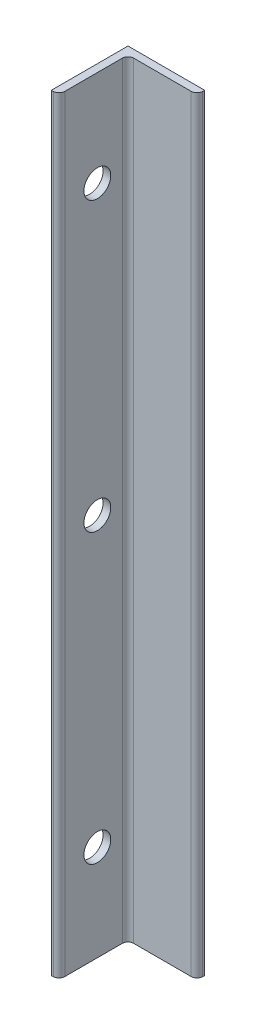
ISO-10303-21;
HEADER;
FILE_DESCRIPTION(('STEP AP214'),'2;1');
FILE_NAME('part.step','',(''),(''),'','','');
FILE_SCHEMA(('AUTOMOTIVE_DESIGN { 1 0 10303 214 1 1 1 1 }'));
ENDSEC;
DATA;
#1=APPLICATION_CONTEXT('core data for automotive mechanical design processes');
#2=APPLICATION_PROTOCOL_DEFINITION('international standard','automotive_design',2000,#1);
#3=PRODUCT_CONTEXT('',#1,'mechanical');
#4=PRODUCT('Part','Part','',(#3));
#5=PRODUCT_RELATED_PRODUCT_CATEGORY('part','',(#4));
#6=PRODUCT_DEFINITION_FORMATION('','',#4);
#7=PRODUCT_DEFINITION_CONTEXT('part definition',#1,'design');
#8=PRODUCT_DEFINITION('design','',#6,#7);
#9=PRODUCT_DEFINITION_SHAPE('','',#8);
#10=(LENGTH_UNIT() NAMED_UNIT(*) SI_UNIT(.MILLI.,.METRE.));
#11=(NAMED_UNIT(*) PLANE_ANGLE_UNIT() SI_UNIT($,.RADIAN.));
#12=(NAMED_UNIT(*) SI_UNIT($,.STERADIAN.) SOLID_ANGLE_UNIT());
#13=UNCERTAINTY_MEASURE_WITH_UNIT(LENGTH_MEASURE(1.E-05),#10,'distance_accuracy_value','');
#14=(GEOMETRIC_REPRESENTATION_CONTEXT(3) GLOBAL_UNCERTAINTY_ASSIGNED_CONTEXT((#13)) GLOBAL_UNIT_ASSIGNED_CONTEXT((#10,
#11,#12)) REPRESENTATION_CONTEXT('',''));
#15=CARTESIAN_POINT('',(0.,0.,0.));
#16=DIRECTION('',(0.,0.,1.));
#17=DIRECTION('',(1.,0.,0.));
#18=AXIS2_PLACEMENT_3D('',#15,#16,#17);
#19=CARTESIAN_POINT('',(-27.4998721449563,400.,-28.2131532770166));
#20=DIRECTION('',(-1.,0.,0.));
#21=DIRECTION('',(0.,0.,1.));
#22=AXIS2_PLACEMENT_3D('',#19,#20,#21);
#23=PLANE('',#22);
#24=DIRECTION('',(0.,0.,-1.));
#25=VECTOR('',#24,1.);
#26=CARTESIAN_POINT('',(-27.4998721449561,3.33066907387547E-12,-28.2131532770167));
#27=LINE('',#26,#25);
#28=CARTESIAN_POINT('',(-27.4998721449561,3.33066907387547E-12,-28.2131532770167));
#29=VERTEX_POINT('',#28);
#30=CARTESIAN_POINT('',(-27.4998721449559,0.,-29.2131532770167));
#31=VERTEX_POINT('',#30);
#32=EDGE_CURVE('E145',#29,#31,#27,.T.);
#33=ORIENTED_EDGE('',*,*,#32,.T.);
#34=DIRECTION('',(0.,-1.,0.));
#35=VECTOR('',#34,1.);
#36=CARTESIAN_POINT('',(-27.4998721449561,400.,-29.2131532770166));
#37=LINE('',#36,#35);
#38=CARTESIAN_POINT('',(-27.4998721449561,400.,-29.2131532770166));
#39=VERTEX_POINT('',#38);
#40=EDGE_CURVE('E13',#39,#31,#37,.T.);
#41=ORIENTED_EDGE('',*,*,#40,.F.);
#42=DIRECTION('',(0.,0.,-1.));
#43=VECTOR('',#42,1.);
#44=CARTESIAN_POINT('',(-27.4998721449563,400.,-28.2131532770166));
#45=LINE('',#44,#43);
#46=CARTESIAN_POINT('',(-27.4998721449563,400.,-28.2131532770166));
#47=VERTEX_POINT('',#46);
#48=EDGE_CURVE('E162',#47,#39,#45,.T.);
#49=ORIENTED_EDGE('',*,*,#48,.F.);
#50=DIRECTION('',(0.,-1.,0.));
#51=VECTOR('',#50,1.);
#52=CARTESIAN_POINT('',(-27.4998721449563,400.,-28.2131532770166));
#53=LINE('',#52,#51);
#54=EDGE_CURVE('E141',#47,#29,#53,.T.);
#55=ORIENTED_EDGE('',*,*,#54,.T.);
#56=EDGE_LOOP('',(#33,#41,#49,#55));
#57=FACE_BOUND('',#56,.T.);
#58=ADVANCED_FACE('F43',(#57),#23,.F.);
#59=CARTESIAN_POINT('',(-27.4998721449561,400.,-29.2131532770166));
#60=DIRECTION('',(0.,0.,1.));
#61=DIRECTION('',(1.,0.,0.));
#62=AXIS2_PLACEMENT_3D('',#59,#60,#61);
#63=PLANE('',#62);
#64=DIRECTION('',(-1.,0.,0.));
#65=VECTOR('',#64,1.);
#66=CARTESIAN_POINT('',(-27.4998721449559,0.,-29.2131532770167));
#67=LINE('',#66,#65);
#68=CARTESIAN_POINT('',(-67.4998721449561,-8.88178419700125E-13,-29.2131532770167));
#69=VERTEX_POINT('',#68);
#70=EDGE_CURVE('E148',#31,#69,#67,.T.);
#71=ORIENTED_EDGE('',*,*,#70,.T.);
#72=DIRECTION('',(0.,-1.,0.));
#73=VECTOR('',#72,1.);
#74=CARTESIAN_POINT('',(-67.4998721449561,400.,-29.2131532770166));
#75=LINE('',#74,#73);
#76=CARTESIAN_POINT('',(-67.4998721449561,400.,-29.2131532770166));
#77=VERTEX_POINT('',#76);
#78=EDGE_CURVE('E51',#77,#69,#75,.T.);
#79=ORIENTED_EDGE('',*,*,#78,.F.);
#80=DIRECTION('',(-1.,0.,0.));
#81=VECTOR('',#80,1.);
#82=CARTESIAN_POINT('',(-27.4998721449561,400.,-29.2131532770166));
#83=LINE('',#82,#81);
#84=EDGE_CURVE('E105',#39,#77,#83,.T.);
#85=ORIENTED_EDGE('',*,*,#84,.F.);
#86=ORIENTED_EDGE('',*,*,#40,.T.);
#87=EDGE_LOOP('',(#71,#79,#85,#86));
#88=FACE_BOUND('',#87,.T.);
#89=ADVANCED_FACE('F245',(#88),#63,.F.);
#90=CARTESIAN_POINT('',(-67.4998721449561,400.,-29.2131532770166));
#91=DIRECTION('',(1.,0.,0.));
#92=DIRECTION('',(0.,0.,-1.));
#93=AXIS2_PLACEMENT_3D('',#90,#91,#92);
#94=PLANE('',#93);
#95=CARTESIAN_POINT('',(-67.4998721449557,350.,-9.21315327701666));
#96=DIRECTION('',(1.,0.,0.));
#97=DIRECTION('',(0.,0.,-1.));
#98=AXIS2_PLACEMENT_3D('',#95,#96,#97);
#99=CIRCLE('',#98,7.00000000000001);
#100=CARTESIAN_POINT('',(-67.4998721449557,350.,-16.2131532770167));
#101=VERTEX_POINT('',#100);
#102=EDGE_CURVE('E149',#101,#101,#99,.T.);
#103=ORIENTED_EDGE('',*,*,#102,.T.);
#104=EDGE_LOOP('',(#103));
#105=FACE_BOUND('',#104,.T.);
#106=CARTESIAN_POINT('',(-67.4998721449561,49.9999999999992,-9.2131532770165));
#107=DIRECTION('',(1.,0.,0.));
#108=DIRECTION('',(0.,0.,-1.));
#109=AXIS2_PLACEMENT_3D('',#106,#107,#108);
#110=CIRCLE('',#109,7.);
#111=CARTESIAN_POINT('',(-67.4998721449561,49.9999999999992,-16.2131532770165));
#112=VERTEX_POINT('',#111);
#113=EDGE_CURVE('E205',#112,#112,#110,.T.);
#114=ORIENTED_EDGE('',*,*,#113,.T.);
#115=EDGE_LOOP('',(#114));
#116=FACE_BOUND('',#115,.T.);
#117=CARTESIAN_POINT('',(-67.4998721449556,200.,-9.21315327701583));
#118=DIRECTION('',(1.,0.,0.));
#119=DIRECTION('',(0.,0.,-1.));
#120=AXIS2_PLACEMENT_3D('',#117,#118,#119);
#121=CIRCLE('',#120,7.00000000000001);
#122=CARTESIAN_POINT('',(-67.4998721449556,200.,-16.2131532770158));
#123=VERTEX_POINT('',#122);
#124=EDGE_CURVE('E208',#123,#123,#121,.T.);
#125=ORIENTED_EDGE('',*,*,#124,.T.);
#126=EDGE_LOOP('',(#125));
#127=FACE_BOUND('',#126,.T.);
#128=DIRECTION('',(0.,0.,1.));
#129=VECTOR('',#128,1.);
#130=CARTESIAN_POINT('',(-67.4998721449561,-8.88178419700125E-13,-29.2131532770167));
#131=LINE('',#130,#129);
#132=CARTESIAN_POINT('',(-67.4998721449561,-8.88178419700125E-13,10.7868467229834));
#133=VERTEX_POINT('',#132);
#134=EDGE_CURVE('E151',#69,#133,#131,.T.);
#135=ORIENTED_EDGE('',*,*,#134,.T.);
#136=DIRECTION('',(0.,-1.,0.));
#137=VECTOR('',#136,1.);
#138=CARTESIAN_POINT('',(-67.4998721449561,400.000000000003,10.7868467229842));
#139=LINE('',#138,#137);
#140=CARTESIAN_POINT('',(-67.4998721449561,400.000000000003,10.7868467229842));
#141=VERTEX_POINT('',#140);
#142=EDGE_CURVE('E172',#141,#133,#139,.T.);
#143=ORIENTED_EDGE('',*,*,#142,.F.);
#144=DIRECTION('',(0.,0.,1.));
#145=VECTOR('',#144,1.);
#146=CARTESIAN_POINT('',(-67.4998721449561,400.,-29.2131532770166));
#147=LINE('',#146,#145);
#148=EDGE_CURVE('E180',#77,#141,#147,.T.);
#149=ORIENTED_EDGE('',*,*,#148,.F.);
#150=ORIENTED_EDGE('',*,*,#78,.T.);
#151=EDGE_LOOP('',(#135,#143,#149,#150));
#152=FACE_BOUND('',#151,.T.);
#153=ADVANCED_FACE('F178',(#105,#116,#127,#152),#94,.F.);
#154=CARTESIAN_POINT('',(-67.4998721449561,400.000000000003,10.7868467229842));
#155=DIRECTION('',(0.,0.,-1.));
#156=DIRECTION('',(-1.,0.,0.));
#157=AXIS2_PLACEMENT_3D('',#154,#155,#156);
#158=PLANE('',#157);
#159=DIRECTION('',(1.,0.,0.));
#160=VECTOR('',#159,1.);
#161=CARTESIAN_POINT('',(-67.4998721449561,-8.88178419700125E-13,10.7868467229834));
#162=LINE('',#161,#160);
#163=CARTESIAN_POINT('',(-66.4998721449561,-8.88178419700125E-13,10.7868467229834));
#164=VERTEX_POINT('',#163);
#165=EDGE_CURVE('E153',#133,#164,#162,.T.);
#166=ORIENTED_EDGE('',*,*,#165,.T.);
#167=DIRECTION('',(0.,-1.,0.));
#168=VECTOR('',#167,1.);
#169=CARTESIAN_POINT('',(-66.4998721449561,400.000000000003,10.7868467229834));
#170=LINE('',#169,#168);
#171=CARTESIAN_POINT('',(-66.4998721449561,400.000000000003,10.7868467229834));
#172=VERTEX_POINT('',#171);
#173=EDGE_CURVE('E169',#172,#164,#170,.T.);
#174=ORIENTED_EDGE('',*,*,#173,.F.);
#175=DIRECTION('',(1.,0.,0.));
#176=VECTOR('',#175,1.);
#177=CARTESIAN_POINT('',(-67.4998721449561,400.000000000003,10.7868467229842));
#178=LINE('',#177,#176);
#179=EDGE_CURVE('E196',#141,#172,#178,.T.);
#180=ORIENTED_EDGE('',*,*,#179,.F.);
#181=ORIENTED_EDGE('',*,*,#142,.T.);
#182=EDGE_LOOP('',(#166,#174,#180,#181));
#183=FACE_BOUND('',#182,.T.);
#184=ADVANCED_FACE('F189',(#183),#158,.F.);
#185=CARTESIAN_POINT('',(-66.4998721449561,400.,7.78684672298335));
#186=DIRECTION('',(0.,-1.,0.));
#187=DIRECTION('',(0.,0.,-1.));
#188=AXIS2_PLACEMENT_3D('',#185,#186,#187);
#189=CYLINDRICAL_SURFACE('',#188,3.);
#190=CARTESIAN_POINT('',(-66.4998721449561,3.33066907387547E-12,7.78684672298335));
#191=DIRECTION('',(0.,1.,0.));
#192=DIRECTION('',(0.,0.,1.));
#193=AXIS2_PLACEMENT_3D('',#190,#191,#192);
#194=CIRCLE('',#193,3.);
#195=CARTESIAN_POINT('',(-63.4998721449561,3.33066907387547E-12,7.78684672298335));
#196=VERTEX_POINT('',#195);
#197=EDGE_CURVE('E155',#164,#196,#194,.T.);
#198=ORIENTED_EDGE('',*,*,#197,.T.);
#199=DIRECTION('',(0.,-1.,0.));
#200=VECTOR('',#199,1.);
#201=CARTESIAN_POINT('',(-63.4998721449561,400.,7.78684672298402));
#202=LINE('',#201,#200);
#203=CARTESIAN_POINT('',(-63.4998721449561,400.,7.78684672298402));
#204=VERTEX_POINT('',#203);
#205=EDGE_CURVE('E166',#204,#196,#202,.T.);
#206=ORIENTED_EDGE('',*,*,#205,.F.);
#207=CARTESIAN_POINT('',(-66.4998721449561,400.,7.78684672298335));
#208=DIRECTION('',(0.,1.,0.));
#209=DIRECTION('',(0.,0.,1.));
#210=AXIS2_PLACEMENT_3D('',#207,#208,#209);
#211=CIRCLE('',#210,3.);
#212=EDGE_CURVE('E195',#172,#204,#211,.T.);
#213=ORIENTED_EDGE('',*,*,#212,.F.);
#214=ORIENTED_EDGE('',*,*,#173,.T.);
#215=EDGE_LOOP('',(#198,#206,#213,#214));
#216=FACE_BOUND('',#215,.T.);
#217=ADVANCED_FACE('F193',(#216),#189,.T.);
#218=CARTESIAN_POINT('',(-63.4998721449561,400.,7.78684672298402));
#219=DIRECTION('',(-1.,0.,0.));
#220=DIRECTION('',(0.,0.,1.));
#221=AXIS2_PLACEMENT_3D('',#218,#219,#220);
#222=PLANE('',#221);
#223=CARTESIAN_POINT('',(-63.4998721449557,350.,-9.21315327701672));
#224=DIRECTION('',(1.,0.,0.));
#225=DIRECTION('',(0.,0.,-1.));
#226=AXIS2_PLACEMENT_3D('',#223,#224,#225);
#227=CIRCLE('',#226,7.00000000000001);
#228=CARTESIAN_POINT('',(-63.4998721449557,350.,-16.2131532770167));
#229=VERTEX_POINT('',#228);
#230=EDGE_CURVE('E215',#229,#229,#227,.T.);
#231=ORIENTED_EDGE('',*,*,#230,.F.);
#232=EDGE_LOOP('',(#231));
#233=FACE_BOUND('',#232,.T.);
#234=CARTESIAN_POINT('',(-63.4998721449561,49.9999999999992,-9.21315327701661));
#235=DIRECTION('',(1.,0.,0.));
#236=DIRECTION('',(0.,0.,-1.));
#237=AXIS2_PLACEMENT_3D('',#234,#235,#236);
#238=CIRCLE('',#237,7.);
#239=CARTESIAN_POINT('',(-63.4998721449561,49.9999999999992,-16.2131532770166));
#240=VERTEX_POINT('',#239);
#241=EDGE_CURVE('E214',#240,#240,#238,.T.);
#242=ORIENTED_EDGE('',*,*,#241,.F.);
#243=EDGE_LOOP('',(#242));
#244=FACE_BOUND('',#243,.T.);
#245=CARTESIAN_POINT('',(-63.4998721449556,200.,-9.21315327701583));
#246=DIRECTION('',(1.,0.,0.));
#247=DIRECTION('',(0.,0.,-1.));
#248=AXIS2_PLACEMENT_3D('',#245,#246,#247);
#249=CIRCLE('',#248,7.00000000000001);
#250=CARTESIAN_POINT('',(-63.4998721449556,200.,-16.2131532770158));
#251=VERTEX_POINT('',#250);
#252=EDGE_CURVE('E211',#251,#251,#249,.T.);
#253=ORIENTED_EDGE('',*,*,#252,.F.);
#254=EDGE_LOOP('',(#253));
#255=FACE_BOUND('',#254,.T.);
#256=DIRECTION('',(0.,0.,-1.));
#257=VECTOR('',#256,1.);
#258=CARTESIAN_POINT('',(-63.4998721449561,3.33066907387547E-12,7.7868467229833));
#259=LINE('',#258,#257);
#260=CARTESIAN_POINT('',(-63.4998721449561,0.,-22.2131532770166));
#261=VERTEX_POINT('',#260);
#262=EDGE_CURVE('E157',#196,#261,#259,.T.);
#263=ORIENTED_EDGE('',*,*,#262,.T.);
#264=DIRECTION('',(0.,-1.,0.));
#265=VECTOR('',#264,1.);
#266=CARTESIAN_POINT('',(-63.4998721449561,399.999999999999,-22.2131532770167));
#267=LINE('',#266,#265);
#268=CARTESIAN_POINT('',(-63.4998721449561,399.999999999999,-22.2131532770167));
#269=VERTEX_POINT('',#268);
#270=EDGE_CURVE('E136',#269,#261,#267,.T.);
#271=ORIENTED_EDGE('',*,*,#270,.F.);
#272=DIRECTION('',(0.,0.,-1.));
#273=VECTOR('',#272,1.);
#274=CARTESIAN_POINT('',(-63.4998721449561,400.,7.78684672298402));
#275=LINE('',#274,#273);
#276=EDGE_CURVE('E127',#204,#269,#275,.T.);
#277=ORIENTED_EDGE('',*,*,#276,.F.);
#278=ORIENTED_EDGE('',*,*,#205,.T.);
#279=EDGE_LOOP('',(#263,#271,#277,#278));
#280=FACE_BOUND('',#279,.T.);
#281=ADVANCED_FACE('F224',(#233,#244,#255,#280),#222,.F.);
#282=CARTESIAN_POINT('',(-60.4998721449561,399.999999999999,-22.2131532770167));
#283=DIRECTION('',(0.,-1.,0.));
#284=DIRECTION('',(0.,0.,-1.));
#285=AXIS2_PLACEMENT_3D('',#282,#283,#284);
#286=CYLINDRICAL_SURFACE('',#285,3.);
#287=CARTESIAN_POINT('',(-60.4998721449561,0.,-22.2131532770166));
#288=DIRECTION('',(0.,-1.,0.));
#289=DIRECTION('',(0.,0.,-1.));
#290=AXIS2_PLACEMENT_3D('',#287,#288,#289);
#291=CIRCLE('',#290,3.);
#292=CARTESIAN_POINT('',(-60.4998721449561,0.,-25.2131532770166));
#293=VERTEX_POINT('',#292);
#294=EDGE_CURVE('E135',#261,#293,#291,.T.);
#295=ORIENTED_EDGE('',*,*,#294,.T.);
#296=DIRECTION('',(0.,-1.,0.));
#297=VECTOR('',#296,1.);
#298=CARTESIAN_POINT('',(-60.4998721449561,400.,-25.2131532770167));
#299=LINE('',#298,#297);
#300=CARTESIAN_POINT('',(-60.4998721449561,400.,-25.2131532770167));
#301=VERTEX_POINT('',#300);
#302=EDGE_CURVE('E132',#301,#293,#299,.T.);
#303=ORIENTED_EDGE('',*,*,#302,.F.);
#304=CARTESIAN_POINT('',(-60.4998721449561,399.999999999999,-22.2131532770167));
#305=DIRECTION('',(0.,-1.,0.));
#306=DIRECTION('',(0.,0.,-1.));
#307=AXIS2_PLACEMENT_3D('',#304,#305,#306);
#308=CIRCLE('',#307,3.);
#309=EDGE_CURVE('E121',#269,#301,#308,.T.);
#310=ORIENTED_EDGE('',*,*,#309,.F.);
#311=ORIENTED_EDGE('',*,*,#270,.T.);
#312=EDGE_LOOP('',(#295,#303,#310,#311));
#313=FACE_BOUND('',#312,.T.);
#314=ADVANCED_FACE('F133',(#313),#286,.F.);
#315=CARTESIAN_POINT('',(-60.4998721449561,400.,-25.2131532770167));
#316=DIRECTION('',(0.,0.,-1.));
#317=DIRECTION('',(-1.,0.,0.));
#318=AXIS2_PLACEMENT_3D('',#315,#316,#317);
#319=PLANE('',#318);
#320=DIRECTION('',(1.,0.,0.));
#321=VECTOR('',#320,1.);
#322=CARTESIAN_POINT('',(-60.4998721449561,0.,-25.2131532770166));
#323=LINE('',#322,#321);
#324=CARTESIAN_POINT('',(-30.4998721449559,3.33066907387547E-12,-25.2131532770166));
#325=VERTEX_POINT('',#324);
#326=EDGE_CURVE('E91',#293,#325,#323,.T.);
#327=ORIENTED_EDGE('',*,*,#326,.T.);
#328=DIRECTION('',(0.,-1.,0.));
#329=VECTOR('',#328,1.);
#330=CARTESIAN_POINT('',(-30.4998721449561,400.,-25.2131532770167));
#331=LINE('',#330,#329);
#332=CARTESIAN_POINT('',(-30.4998721449561,400.,-25.2131532770167));
#333=VERTEX_POINT('',#332);
#334=EDGE_CURVE('E137',#333,#325,#331,.T.);
#335=ORIENTED_EDGE('',*,*,#334,.F.);
#336=DIRECTION('',(1.,0.,0.));
#337=VECTOR('',#336,1.);
#338=CARTESIAN_POINT('',(-60.4998721449561,400.,-25.2131532770167));
#339=LINE('',#338,#337);
#340=EDGE_CURVE('E125',#301,#333,#339,.T.);
#341=ORIENTED_EDGE('',*,*,#340,.F.);
#342=ORIENTED_EDGE('',*,*,#302,.T.);
#343=EDGE_LOOP('',(#327,#335,#341,#342));
#344=FACE_BOUND('',#343,.T.);
#345=ADVANCED_FACE('F139',(#344),#319,.F.);
#346=CARTESIAN_POINT('',(-30.4998721449563,400.,-28.2131532770167));
#347=DIRECTION('',(0.,-1.,0.));
#348=DIRECTION('',(0.,0.,-1.));
#349=AXIS2_PLACEMENT_3D('',#346,#347,#348);
#350=CYLINDRICAL_SURFACE('',#349,3.);
#351=CARTESIAN_POINT('',(-30.4998721449561,3.33066907387547E-12,-28.2131532770167));
#352=DIRECTION('',(0.,1.,0.));
#353=DIRECTION('',(0.,0.,1.));
#354=AXIS2_PLACEMENT_3D('',#351,#352,#353);
#355=CIRCLE('',#354,3.);
#356=EDGE_CURVE('E97',#325,#29,#355,.T.);
#357=ORIENTED_EDGE('',*,*,#356,.T.);
#358=ORIENTED_EDGE('',*,*,#54,.F.);
#359=CARTESIAN_POINT('',(-30.4998721449563,400.,-28.2131532770167));
#360=DIRECTION('',(0.,1.,0.));
#361=DIRECTION('',(0.,0.,1.));
#362=AXIS2_PLACEMENT_3D('',#359,#360,#361);
#363=CIRCLE('',#362,3.);
#364=EDGE_CURVE('E59',#333,#47,#363,.T.);
#365=ORIENTED_EDGE('',*,*,#364,.F.);
#366=ORIENTED_EDGE('',*,*,#334,.T.);
#367=EDGE_LOOP('',(#357,#358,#365,#366));
#368=FACE_BOUND('',#367,.T.);
#369=ADVANCED_FACE('F234',(#368),#350,.T.);
#370=CARTESIAN_POINT('',(-66.4998721449561,400.,7.78684672298335));
#371=DIRECTION('',(0.,1.,0.));
#372=DIRECTION('',(0.,0.,1.));
#373=AXIS2_PLACEMENT_3D('',#370,#371,#372);
#374=PLANE('',#373);
#375=ORIENTED_EDGE('',*,*,#48,.T.);
#376=ORIENTED_EDGE('',*,*,#84,.T.);
#377=ORIENTED_EDGE('',*,*,#148,.T.);
#378=ORIENTED_EDGE('',*,*,#179,.T.);
#379=ORIENTED_EDGE('',*,*,#212,.T.);
#380=ORIENTED_EDGE('',*,*,#276,.T.);
#381=ORIENTED_EDGE('',*,*,#309,.T.);
#382=ORIENTED_EDGE('',*,*,#340,.T.);
#383=ORIENTED_EDGE('',*,*,#364,.T.);
#384=EDGE_LOOP('',(#375,#376,#377,#378,#379,#380,#381,#382,#383));
#385=FACE_BOUND('',#384,.T.);
#386=ADVANCED_FACE('F123',(#385),#374,.T.);
#387=CARTESIAN_POINT('',(-66.4998721449561,3.33066907387547E-12,7.78684672298335));
#388=DIRECTION('',(0.,1.,0.));
#389=DIRECTION('',(0.,0.,1.));
#390=AXIS2_PLACEMENT_3D('',#387,#388,#389);
#391=PLANE('',#390);
#392=ORIENTED_EDGE('',*,*,#32,.F.);
#393=ORIENTED_EDGE('',*,*,#356,.F.);
#394=ORIENTED_EDGE('',*,*,#326,.F.);
#395=ORIENTED_EDGE('',*,*,#294,.F.);
#396=ORIENTED_EDGE('',*,*,#262,.F.);
#397=ORIENTED_EDGE('',*,*,#197,.F.);
#398=ORIENTED_EDGE('',*,*,#165,.F.);
#399=ORIENTED_EDGE('',*,*,#134,.F.);
#400=ORIENTED_EDGE('',*,*,#70,.F.);
#401=EDGE_LOOP('',(#392,#393,#394,#395,#396,#397,#398,#399,#400));
#402=FACE_BOUND('',#401,.T.);
#403=ADVANCED_FACE('F184',(#402),#391,.F.);
#404=CARTESIAN_POINT('',(-73.4998721449556,200.,-9.21315327701583));
#405=DIRECTION('',(1.,0.,0.));
#406=DIRECTION('',(0.,0.,-1.));
#407=AXIS2_PLACEMENT_3D('',#404,#405,#406);
#408=CYLINDRICAL_SURFACE('',#407,7.00000000000001);
#409=ORIENTED_EDGE('',*,*,#252,.T.);
#410=EDGE_LOOP('',(#409));
#411=FACE_BOUND('',#410,.T.);
#412=ORIENTED_EDGE('',*,*,#124,.F.);
#413=EDGE_LOOP('',(#412));
#414=FACE_BOUND('',#413,.T.);
#415=ADVANCED_FACE('F287',(#411,#414),#408,.F.);
#416=CARTESIAN_POINT('',(-73.4998721449561,49.9999999999992,-9.21315327701644));
#417=DIRECTION('',(1.,0.,0.));
#418=DIRECTION('',(0.,0.,-1.));
#419=AXIS2_PLACEMENT_3D('',#416,#417,#418);
#420=CYLINDRICAL_SURFACE('',#419,7.);
#421=ORIENTED_EDGE('',*,*,#241,.T.);
#422=EDGE_LOOP('',(#421));
#423=FACE_BOUND('',#422,.T.);
#424=ORIENTED_EDGE('',*,*,#113,.F.);
#425=EDGE_LOOP('',(#424));
#426=FACE_BOUND('',#425,.T.);
#427=ADVANCED_FACE('F221',(#423,#426),#420,.F.);
#428=CARTESIAN_POINT('',(-73.4998721449557,349.999999999999,-9.21315327701672));
#429=DIRECTION('',(1.,0.,0.));
#430=DIRECTION('',(0.,0.,-1.));
#431=AXIS2_PLACEMENT_3D('',#428,#429,#430);
#432=CYLINDRICAL_SURFACE('',#431,7.00000000000001);
#433=ORIENTED_EDGE('',*,*,#230,.T.);
#434=EDGE_LOOP('',(#433));
#435=FACE_BOUND('',#434,.T.);
#436=ORIENTED_EDGE('',*,*,#102,.F.);
#437=EDGE_LOOP('',(#436));
#438=FACE_BOUND('',#437,.T.);
#439=ADVANCED_FACE('F304',(#435,#438),#432,.F.);
#440=CLOSED_SHELL('',(#58,#89,#153,#184,#217,#281,#314,#345,#369,#386,#403,#415,#427,#439));
#441=MANIFOLD_SOLID_BREP('B2',#440);
#442=ADVANCED_BREP_SHAPE_REPRESENTATION('',(#18,#441),#14);
#443=SHAPE_DEFINITION_REPRESENTATION(#9,#442);
ENDSEC;
END-ISO-10303-21;
